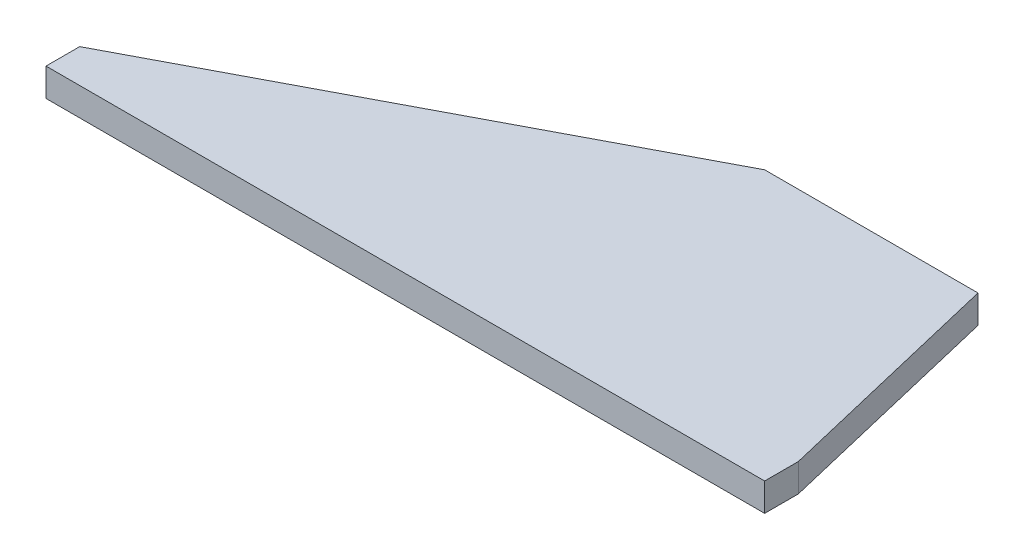
ISO-10303-21;
HEADER;
FILE_DESCRIPTION(('STEP AP214'),'2;1');
FILE_NAME('part.step','',(''),(''),'','','');
FILE_SCHEMA(('AUTOMOTIVE_DESIGN { 1 0 10303 214 1 1 1 1 }'));
ENDSEC;
DATA;
#1=APPLICATION_CONTEXT('core data for automotive mechanical design processes');
#2=APPLICATION_PROTOCOL_DEFINITION('international standard','automotive_design',2000,#1);
#3=PRODUCT_CONTEXT('',#1,'mechanical');
#4=PRODUCT('Part','Part','',(#3));
#5=PRODUCT_RELATED_PRODUCT_CATEGORY('part','',(#4));
#6=PRODUCT_DEFINITION_FORMATION('','',#4);
#7=PRODUCT_DEFINITION_CONTEXT('part definition',#1,'design');
#8=PRODUCT_DEFINITION('design','',#6,#7);
#9=PRODUCT_DEFINITION_SHAPE('','',#8);
#10=(LENGTH_UNIT() NAMED_UNIT(*) SI_UNIT(.MILLI.,.METRE.));
#11=(NAMED_UNIT(*) PLANE_ANGLE_UNIT() SI_UNIT($,.RADIAN.));
#12=(NAMED_UNIT(*) SI_UNIT($,.STERADIAN.) SOLID_ANGLE_UNIT());
#13=UNCERTAINTY_MEASURE_WITH_UNIT(LENGTH_MEASURE(1.E-05),#10,'distance_accuracy_value','');
#14=(GEOMETRIC_REPRESENTATION_CONTEXT(3) GLOBAL_UNCERTAINTY_ASSIGNED_CONTEXT((#13)) GLOBAL_UNIT_ASSIGNED_CONTEXT((#10,
#11,#12)) REPRESENTATION_CONTEXT('',''));
#15=CARTESIAN_POINT('',(0.,0.,0.));
#16=DIRECTION('',(0.,0.,1.));
#17=DIRECTION('',(1.,0.,0.));
#18=AXIS2_PLACEMENT_3D('',#15,#16,#17);
#19=CARTESIAN_POINT('',(0.,6.35,7.62));
#20=DIRECTION('',(1.,0.,0.));
#21=DIRECTION('',(0.,0.,-1.));
#22=AXIS2_PLACEMENT_3D('',#19,#20,#21);
#23=PLANE('',#22);
#24=DIRECTION('',(0.,0.,1.));
#25=VECTOR('',#24,1.);
#26=CARTESIAN_POINT('',(0.,0.,7.62));
#27=LINE('',#26,#25);
#28=CARTESIAN_POINT('',(0.,0.,0.));
#29=VERTEX_POINT('',#28);
#30=CARTESIAN_POINT('',(0.,0.,7.62));
#31=VERTEX_POINT('',#30);
#32=EDGE_CURVE('E131',#29,#31,#27,.T.);
#33=ORIENTED_EDGE('',*,*,#32,.T.);
#34=DIRECTION('',(0.,-1.,0.));
#35=VECTOR('',#34,1.);
#36=CARTESIAN_POINT('',(0.,6.35,7.62));
#37=LINE('',#36,#35);
#38=CARTESIAN_POINT('',(0.,6.35,7.62));
#39=VERTEX_POINT('',#38);
#40=EDGE_CURVE('E11',#39,#31,#37,.T.);
#41=ORIENTED_EDGE('',*,*,#40,.F.);
#42=DIRECTION('',(0.,0.,1.));
#43=VECTOR('',#42,1.);
#44=CARTESIAN_POINT('',(0.,6.35,7.62));
#45=LINE('',#44,#43);
#46=CARTESIAN_POINT('',(0.,6.35,0.));
#47=VERTEX_POINT('',#46);
#48=EDGE_CURVE('E147',#47,#39,#45,.T.);
#49=ORIENTED_EDGE('',*,*,#48,.F.);
#50=DIRECTION('',(0.,-1.,0.));
#51=VECTOR('',#50,1.);
#52=CARTESIAN_POINT('',(0.,6.35,0.));
#53=LINE('',#52,#51);
#54=EDGE_CURVE('E127',#47,#29,#53,.T.);
#55=ORIENTED_EDGE('',*,*,#54,.T.);
#56=EDGE_LOOP('',(#33,#41,#49,#55));
#57=FACE_BOUND('',#56,.T.);
#58=ADVANCED_FACE('F42',(#57),#23,.F.);
#59=CARTESIAN_POINT('',(0.,6.35,7.62));
#60=DIRECTION('',(0.,0.,-1.));
#61=DIRECTION('',(-1.,0.,0.));
#62=AXIS2_PLACEMENT_3D('',#59,#60,#61);
#63=PLANE('',#62);
#64=DIRECTION('',(1.,0.,0.));
#65=VECTOR('',#64,1.);
#66=CARTESIAN_POINT('',(0.,0.,7.62));
#67=LINE('',#66,#65);
#68=CARTESIAN_POINT('',(162.56,0.,7.62));
#69=VERTEX_POINT('',#68);
#70=EDGE_CURVE('E135',#31,#69,#67,.T.);
#71=ORIENTED_EDGE('',*,*,#70,.T.);
#72=DIRECTION('',(0.,-1.,0.));
#73=VECTOR('',#72,1.);
#74=CARTESIAN_POINT('',(162.56,6.35,7.62));
#75=LINE('',#74,#73);
#76=CARTESIAN_POINT('',(162.56,6.35,7.62));
#77=VERTEX_POINT('',#76);
#78=EDGE_CURVE('E51',#77,#69,#75,.T.);
#79=ORIENTED_EDGE('',*,*,#78,.F.);
#80=DIRECTION('',(1.,0.,0.));
#81=VECTOR('',#80,1.);
#82=CARTESIAN_POINT('',(0.,6.35,7.62));
#83=LINE('',#82,#81);
#84=EDGE_CURVE('E96',#39,#77,#83,.T.);
#85=ORIENTED_EDGE('',*,*,#84,.F.);
#86=ORIENTED_EDGE('',*,*,#40,.T.);
#87=EDGE_LOOP('',(#71,#79,#85,#86));
#88=FACE_BOUND('',#87,.T.);
#89=ADVANCED_FACE('F175',(#88),#63,.F.);
#90=CARTESIAN_POINT('',(162.56,6.35,7.62));
#91=DIRECTION('',(-1.,0.,0.));
#92=DIRECTION('',(0.,0.,1.));
#93=AXIS2_PLACEMENT_3D('',#90,#91,#92);
#94=PLANE('',#93);
#95=DIRECTION('',(0.,0.,-1.));
#96=VECTOR('',#95,1.);
#97=CARTESIAN_POINT('',(162.56,0.,7.62));
#98=LINE('',#97,#96);
#99=CARTESIAN_POINT('',(162.56,0.,0.));
#100=VERTEX_POINT('',#99);
#101=EDGE_CURVE('E138',#69,#100,#98,.T.);
#102=ORIENTED_EDGE('',*,*,#101,.T.);
#103=DIRECTION('',(0.,-1.,0.));
#104=VECTOR('',#103,1.);
#105=CARTESIAN_POINT('',(162.56,6.35,0.));
#106=LINE('',#105,#104);
#107=CARTESIAN_POINT('',(162.56,6.35,0.));
#108=VERTEX_POINT('',#107);
#109=EDGE_CURVE('E120',#108,#100,#106,.T.);
#110=ORIENTED_EDGE('',*,*,#109,.F.);
#111=DIRECTION('',(0.,0.,-1.));
#112=VECTOR('',#111,1.);
#113=CARTESIAN_POINT('',(162.56,6.35,7.62));
#114=LINE('',#113,#112);
#115=EDGE_CURVE('E109',#77,#108,#114,.T.);
#116=ORIENTED_EDGE('',*,*,#115,.F.);
#117=ORIENTED_EDGE('',*,*,#78,.T.);
#118=EDGE_LOOP('',(#102,#110,#116,#117));
#119=FACE_BOUND('',#118,.T.);
#120=ADVANCED_FACE('F157',(#119),#94,.F.);
#121=CARTESIAN_POINT('',(149.86,6.35,-53.34));
#122=DIRECTION('',(-0.972806214685367,0.,0.23162052730604));
#123=DIRECTION('',(0.23162052730604,0.,0.972806214685367));
#124=AXIS2_PLACEMENT_3D('',#121,#122,#123);
#125=PLANE('',#124);
#126=DIRECTION('',(-0.23162052730604,0.,-0.972806214685367));
#127=VECTOR('',#126,1.);
#128=CARTESIAN_POINT('',(149.86,0.,-53.34));
#129=LINE('',#128,#127);
#130=CARTESIAN_POINT('',(149.86,0.,-53.34));
#131=VERTEX_POINT('',#130);
#132=EDGE_CURVE('E118',#100,#131,#129,.T.);
#133=ORIENTED_EDGE('',*,*,#132,.T.);
#134=DIRECTION('',(0.,-1.,0.));
#135=VECTOR('',#134,1.);
#136=CARTESIAN_POINT('',(149.86,6.35,-53.34));
#137=LINE('',#136,#135);
#138=CARTESIAN_POINT('',(149.86,6.35,-53.34));
#139=VERTEX_POINT('',#138);
#140=EDGE_CURVE('E115',#139,#131,#137,.T.);
#141=ORIENTED_EDGE('',*,*,#140,.F.);
#142=DIRECTION('',(-0.23162052730604,0.,-0.972806214685367));
#143=VECTOR('',#142,1.);
#144=CARTESIAN_POINT('',(149.86,6.35,-53.34));
#145=LINE('',#144,#143);
#146=EDGE_CURVE('E103',#108,#139,#145,.T.);
#147=ORIENTED_EDGE('',*,*,#146,.F.);
#148=ORIENTED_EDGE('',*,*,#109,.T.);
#149=EDGE_LOOP('',(#133,#141,#147,#148));
#150=FACE_BOUND('',#149,.T.);
#151=ADVANCED_FACE('F116',(#150),#125,.F.);
#152=CARTESIAN_POINT('',(101.6,6.35,-53.34));
#153=DIRECTION('',(0.,0.,1.));
#154=DIRECTION('',(1.,0.,0.));
#155=AXIS2_PLACEMENT_3D('',#152,#153,#154);
#156=PLANE('',#155);
#157=DIRECTION('',(-1.,0.,0.));
#158=VECTOR('',#157,1.);
#159=CARTESIAN_POINT('',(101.6,0.,-53.34));
#160=LINE('',#159,#158);
#161=CARTESIAN_POINT('',(101.6,0.,-53.34));
#162=VERTEX_POINT('',#161);
#163=EDGE_CURVE('E82',#131,#162,#160,.T.);
#164=ORIENTED_EDGE('',*,*,#163,.T.);
#165=DIRECTION('',(0.,-1.,0.));
#166=VECTOR('',#165,1.);
#167=CARTESIAN_POINT('',(101.6,6.35,-53.34));
#168=LINE('',#167,#166);
#169=CARTESIAN_POINT('',(101.6,6.35,-53.34));
#170=VERTEX_POINT('',#169);
#171=EDGE_CURVE('E121',#170,#162,#168,.T.);
#172=ORIENTED_EDGE('',*,*,#171,.F.);
#173=DIRECTION('',(-1.,0.,0.));
#174=VECTOR('',#173,1.);
#175=CARTESIAN_POINT('',(101.6,6.35,-53.34));
#176=LINE('',#175,#174);
#177=EDGE_CURVE('E107',#139,#170,#176,.T.);
#178=ORIENTED_EDGE('',*,*,#177,.F.);
#179=ORIENTED_EDGE('',*,*,#140,.T.);
#180=EDGE_LOOP('',(#164,#172,#178,#179));
#181=FACE_BOUND('',#180,.T.);
#182=ADVANCED_FACE('F123',(#181),#156,.F.);
#183=CARTESIAN_POINT('',(0.,6.35,0.));
#184=DIRECTION('',(0.46483389898992,0.,0.885397902837944));
#185=DIRECTION('',(0.885397902837944,0.,-0.46483389898992));
#186=AXIS2_PLACEMENT_3D('',#183,#184,#185);
#187=PLANE('',#186);
#188=DIRECTION('',(-0.885397902837944,0.,0.46483389898992));
#189=VECTOR('',#188,1.);
#190=CARTESIAN_POINT('',(0.,0.,0.));
#191=LINE('',#190,#189);
#192=EDGE_CURVE('E88',#162,#29,#191,.T.);
#193=ORIENTED_EDGE('',*,*,#192,.T.);
#194=ORIENTED_EDGE('',*,*,#54,.F.);
#195=DIRECTION('',(-0.885397902837944,0.,0.46483389898992));
#196=VECTOR('',#195,1.);
#197=CARTESIAN_POINT('',(0.,6.35,0.));
#198=LINE('',#197,#196);
#199=EDGE_CURVE('E59',#170,#47,#198,.T.);
#200=ORIENTED_EDGE('',*,*,#199,.F.);
#201=ORIENTED_EDGE('',*,*,#171,.T.);
#202=EDGE_LOOP('',(#193,#194,#200,#201));
#203=FACE_BOUND('',#202,.T.);
#204=ADVANCED_FACE('F164',(#203),#187,.F.);
#205=CARTESIAN_POINT('',(0.,6.35,0.));
#206=DIRECTION('',(0.,-1.,0.));
#207=DIRECTION('',(0.,0.,-1.));
#208=AXIS2_PLACEMENT_3D('',#205,#206,#207);
#209=PLANE('',#208);
#210=ORIENTED_EDGE('',*,*,#48,.T.);
#211=ORIENTED_EDGE('',*,*,#84,.T.);
#212=ORIENTED_EDGE('',*,*,#115,.T.);
#213=ORIENTED_EDGE('',*,*,#146,.T.);
#214=ORIENTED_EDGE('',*,*,#177,.T.);
#215=ORIENTED_EDGE('',*,*,#199,.T.);
#216=EDGE_LOOP('',(#210,#211,#212,#213,#214,#215));
#217=FACE_BOUND('',#216,.T.);
#218=ADVANCED_FACE('F105',(#217),#209,.F.);
#219=CARTESIAN_POINT('',(0.,0.,0.));
#220=DIRECTION('',(0.,-1.,0.));
#221=DIRECTION('',(0.,0.,-1.));
#222=AXIS2_PLACEMENT_3D('',#219,#220,#221);
#223=PLANE('',#222);
#224=ORIENTED_EDGE('',*,*,#32,.F.);
#225=ORIENTED_EDGE('',*,*,#192,.F.);
#226=ORIENTED_EDGE('',*,*,#163,.F.);
#227=ORIENTED_EDGE('',*,*,#132,.F.);
#228=ORIENTED_EDGE('',*,*,#101,.F.);
#229=ORIENTED_EDGE('',*,*,#70,.F.);
#230=EDGE_LOOP('',(#224,#225,#226,#227,#228,#229));
#231=FACE_BOUND('',#230,.T.);
#232=ADVANCED_FACE('F160',(#231),#223,.T.);
#233=CLOSED_SHELL('',(#58,#89,#120,#151,#182,#204,#218,#232));
#234=MANIFOLD_SOLID_BREP('B2',#233);
#235=ADVANCED_BREP_SHAPE_REPRESENTATION('',(#18,#234),#14);
#236=SHAPE_DEFINITION_REPRESENTATION(#9,#235);
ENDSEC;
END-ISO-10303-21;
